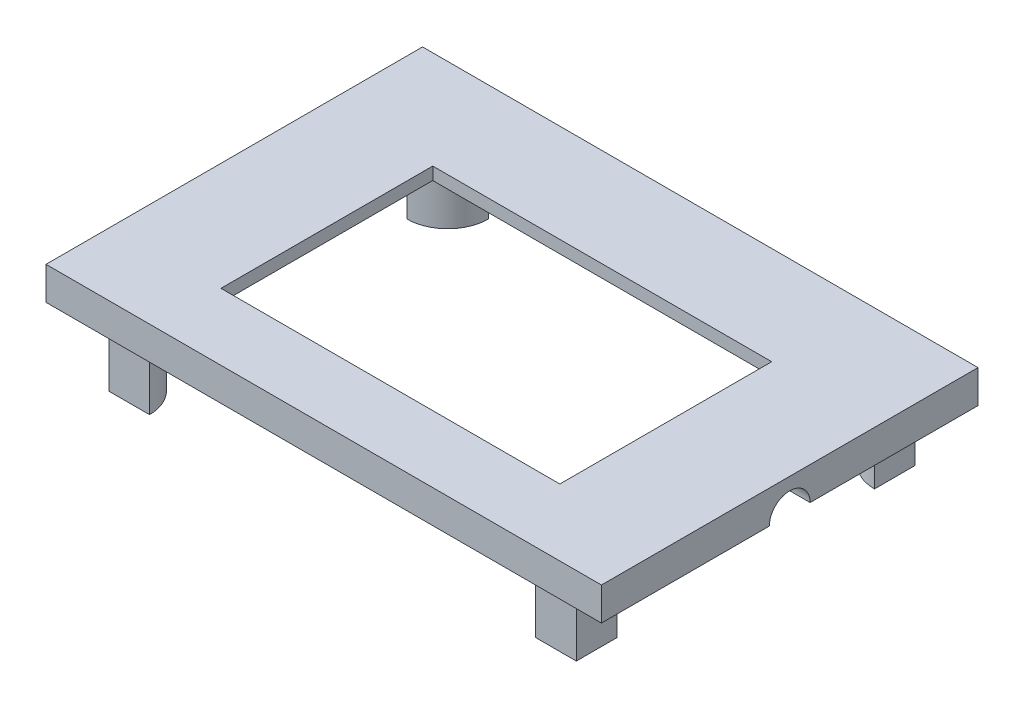
ISO-10303-21;
HEADER;
FILE_DESCRIPTION(('STEP AP214'),'2;1');
FILE_NAME('part.step','',(''),(''),'','','');
FILE_SCHEMA(('AUTOMOTIVE_DESIGN { 1 0 10303 214 1 1 1 1 }'));
ENDSEC;
DATA;
#1=APPLICATION_CONTEXT('core data for automotive mechanical design processes');
#2=APPLICATION_PROTOCOL_DEFINITION('international standard','automotive_design',2000,#1);
#3=PRODUCT_CONTEXT('',#1,'mechanical');
#4=PRODUCT('Part','Part','',(#3));
#5=PRODUCT_RELATED_PRODUCT_CATEGORY('part','',(#4));
#6=PRODUCT_DEFINITION_FORMATION('','',#4);
#7=PRODUCT_DEFINITION_CONTEXT('part definition',#1,'design');
#8=PRODUCT_DEFINITION('design','',#6,#7);
#9=PRODUCT_DEFINITION_SHAPE('','',#8);
#10=(LENGTH_UNIT() NAMED_UNIT(*) SI_UNIT(.MILLI.,.METRE.));
#11=(NAMED_UNIT(*) PLANE_ANGLE_UNIT() SI_UNIT($,.RADIAN.));
#12=(NAMED_UNIT(*) SI_UNIT($,.STERADIAN.) SOLID_ANGLE_UNIT());
#13=UNCERTAINTY_MEASURE_WITH_UNIT(LENGTH_MEASURE(1.E-05),#10,'distance_accuracy_value','');
#14=(GEOMETRIC_REPRESENTATION_CONTEXT(3) GLOBAL_UNCERTAINTY_ASSIGNED_CONTEXT((#13)) GLOBAL_UNIT_ASSIGNED_CONTEXT((#10,
#11,#12)) REPRESENTATION_CONTEXT('',''));
#15=CARTESIAN_POINT('',(0.,0.,0.));
#16=DIRECTION('',(0.,0.,1.));
#17=DIRECTION('',(1.,0.,0.));
#18=AXIS2_PLACEMENT_3D('',#15,#16,#17);
#19=CARTESIAN_POINT('',(-29.8,-2.6,0.));
#20=DIRECTION('',(1.,0.,0.));
#21=DIRECTION('',(0.,0.,-1.));
#22=AXIS2_PLACEMENT_3D('',#19,#20,#21);
#23=PLANE('',#22);
#24=CARTESIAN_POINT('',(-29.8,-2.6,0.));
#25=DIRECTION('',(1.,0.,0.));
#26=DIRECTION('',(0.,0.,-1.));
#27=AXIS2_PLACEMENT_3D('',#24,#25,#26);
#28=CIRCLE('',#27,2.6);
#29=CARTESIAN_POINT('',(-29.8,-2.6,-2.6));
#30=VERTEX_POINT('',#29);
#31=CARTESIAN_POINT('',(-29.8,0.,0.));
#32=VERTEX_POINT('',#31);
#33=EDGE_CURVE('E629',#30,#32,#28,.T.);
#34=ORIENTED_EDGE('',*,*,#33,.F.);
#35=DIRECTION('',(0.,0.,-1.));
#36=VECTOR('',#35,1.);
#37=CARTESIAN_POINT('',(-29.8,-2.6,0.));
#38=LINE('',#37,#36);
#39=CARTESIAN_POINT('',(-29.8,-2.6,-16.4));
#40=VERTEX_POINT('',#39);
#41=EDGE_CURVE('E487',#30,#40,#38,.T.);
#42=ORIENTED_EDGE('',*,*,#41,.T.);
#43=DIRECTION('',(0.,1.,0.));
#44=VECTOR('',#43,1.);
#45=CARTESIAN_POINT('',(-29.8,-10.8,-16.4));
#46=LINE('',#45,#44);
#47=CARTESIAN_POINT('',(-29.8,0.,-16.4));
#48=VERTEX_POINT('',#47);
#49=EDGE_CURVE('E331',#40,#48,#46,.T.);
#50=ORIENTED_EDGE('',*,*,#49,.T.);
#51=DIRECTION('',(0.,0.,-1.));
#52=VECTOR('',#51,1.);
#53=CARTESIAN_POINT('',(-29.8,0.,0.));
#54=LINE('',#53,#52);
#55=EDGE_CURVE('E261',#32,#48,#54,.T.);
#56=ORIENTED_EDGE('',*,*,#55,.F.);
#57=EDGE_LOOP('',(#34,#42,#50,#56));
#58=FACE_BOUND('',#57,.T.);
#59=ADVANCED_FACE('F33',(#58),#23,.T.);
#60=CARTESIAN_POINT('',(29.8,-2.6,0.));
#61=DIRECTION('',(1.,0.,0.));
#62=DIRECTION('',(0.,0.,-1.));
#63=AXIS2_PLACEMENT_3D('',#60,#61,#62);
#64=PLANE('',#63);
#65=DIRECTION('',(0.,0.,-1.));
#66=VECTOR('',#65,1.);
#67=CARTESIAN_POINT('',(29.8,-2.6,0.));
#68=LINE('',#67,#66);
#69=CARTESIAN_POINT('',(29.8,-2.6,-2.6));
#70=VERTEX_POINT('',#69);
#71=CARTESIAN_POINT('',(29.8,-2.6,-16.4));
#72=VERTEX_POINT('',#71);
#73=EDGE_CURVE('E439',#70,#72,#68,.T.);
#74=ORIENTED_EDGE('',*,*,#73,.F.);
#75=CARTESIAN_POINT('',(29.8,-2.6,0.));
#76=DIRECTION('',(1.,0.,0.));
#77=DIRECTION('',(0.,0.,-1.));
#78=AXIS2_PLACEMENT_3D('',#75,#76,#77);
#79=CIRCLE('',#78,2.6);
#80=CARTESIAN_POINT('',(29.8,0.,0.));
#81=VERTEX_POINT('',#80);
#82=EDGE_CURVE('E56',#70,#81,#79,.T.);
#83=ORIENTED_EDGE('',*,*,#82,.T.);
#84=DIRECTION('',(0.,0.,-1.));
#85=VECTOR('',#84,1.);
#86=CARTESIAN_POINT('',(29.8,0.,0.));
#87=LINE('',#86,#85);
#88=CARTESIAN_POINT('',(29.8,0.,-16.4));
#89=VERTEX_POINT('',#88);
#90=EDGE_CURVE('E259',#81,#89,#87,.T.);
#91=ORIENTED_EDGE('',*,*,#90,.T.);
#92=DIRECTION('',(0.,1.,0.));
#93=VECTOR('',#92,1.);
#94=CARTESIAN_POINT('',(29.8,-10.8,-16.4));
#95=LINE('',#94,#93);
#96=EDGE_CURVE('E270',#72,#89,#95,.T.);
#97=ORIENTED_EDGE('',*,*,#96,.F.);
#98=EDGE_LOOP('',(#74,#83,#91,#97));
#99=FACE_BOUND('',#98,.T.);
#100=ADVANCED_FACE('F528',(#99),#64,.F.);
#101=CARTESIAN_POINT('',(0.,-2.6,0.));
#102=DIRECTION('',(0.,1.,0.));
#103=DIRECTION('',(0.,0.,1.));
#104=AXIS2_PLACEMENT_3D('',#101,#102,#103);
#105=PLANE('',#104);
#106=DIRECTION('',(0.,0.,-1.));
#107=VECTOR('',#106,1.);
#108=CARTESIAN_POINT('',(-35.4,-2.6,0.));
#109=LINE('',#108,#107);
#110=CARTESIAN_POINT('',(-35.4,-2.6,24.));
#111=VERTEX_POINT('',#110);
#112=CARTESIAN_POINT('',(-35.4,-2.6,2.6));
#113=VERTEX_POINT('',#112);
#114=EDGE_CURVE('E251',#111,#113,#109,.T.);
#115=ORIENTED_EDGE('',*,*,#114,.T.);
#116=DIRECTION('',(1.,0.,0.));
#117=VECTOR('',#116,1.);
#118=CARTESIAN_POINT('',(-41.2137767414995,-2.6,2.6));
#119=LINE('',#118,#117);
#120=CARTESIAN_POINT('',(-29.8,-2.6,2.6));
#121=VERTEX_POINT('',#120);
#122=EDGE_CURVE('E501',#113,#121,#119,.T.);
#123=ORIENTED_EDGE('',*,*,#122,.T.);
#124=CARTESIAN_POINT('',(-29.8,-2.6,16.4));
#125=VERTEX_POINT('',#124);
#126=EDGE_CURVE('E486',#125,#121,#38,.T.);
#127=ORIENTED_EDGE('',*,*,#126,.F.);
#128=CARTESIAN_POINT('',(-29.8,-2.6,21.6));
#129=VERTEX_POINT('',#128);
#130=EDGE_CURVE('E455',#129,#125,#38,.T.);
#131=ORIENTED_EDGE('',*,*,#130,.F.);
#132=DIRECTION('',(1.,0.,0.));
#133=VECTOR('',#132,1.);
#134=CARTESIAN_POINT('',(0.,-2.6,21.6));
#135=LINE('',#134,#133);
#136=CARTESIAN_POINT('',(-24.6,-2.6,21.6));
#137=VERTEX_POINT('',#136);
#138=EDGE_CURVE('E440',#129,#137,#135,.T.);
#139=ORIENTED_EDGE('',*,*,#138,.T.);
#140=CARTESIAN_POINT('',(24.6,-2.6,21.6));
#141=VERTEX_POINT('',#140);
#142=EDGE_CURVE('E436',#137,#141,#135,.T.);
#143=ORIENTED_EDGE('',*,*,#142,.T.);
#144=DIRECTION('',(-1.,0.,0.));
#145=VECTOR('',#144,1.);
#146=CARTESIAN_POINT('',(0.,-2.6,21.6));
#147=LINE('',#146,#145);
#148=CARTESIAN_POINT('',(29.8,-2.6,21.6));
#149=VERTEX_POINT('',#148);
#150=EDGE_CURVE('E227',#149,#141,#147,.T.);
#151=ORIENTED_EDGE('',*,*,#150,.F.);
#152=CARTESIAN_POINT('',(29.8,-2.6,16.4));
#153=VERTEX_POINT('',#152);
#154=EDGE_CURVE('E434',#149,#153,#68,.T.);
#155=ORIENTED_EDGE('',*,*,#154,.T.);
#156=CARTESIAN_POINT('',(29.8,-2.6,2.6));
#157=VERTEX_POINT('',#156);
#158=EDGE_CURVE('E437',#153,#157,#68,.T.);
#159=ORIENTED_EDGE('',*,*,#158,.T.);
#160=DIRECTION('',(1.,0.,0.));
#161=VECTOR('',#160,1.);
#162=CARTESIAN_POINT('',(-41.2137767414995,-2.6,2.6));
#163=LINE('',#162,#161);
#164=CARTESIAN_POINT('',(35.4,-2.6,2.6));
#165=VERTEX_POINT('',#164);
#166=EDGE_CURVE('E11',#157,#165,#163,.T.);
#167=ORIENTED_EDGE('',*,*,#166,.T.);
#168=DIRECTION('',(0.,0.,-1.));
#169=VECTOR('',#168,1.);
#170=CARTESIAN_POINT('',(35.4,-2.6,0.));
#171=LINE('',#170,#169);
#172=CARTESIAN_POINT('',(35.4,-2.6,24.));
#173=VERTEX_POINT('',#172);
#174=EDGE_CURVE('E235',#173,#165,#171,.T.);
#175=ORIENTED_EDGE('',*,*,#174,.F.);
#176=DIRECTION('',(1.,0.,0.));
#177=VECTOR('',#176,1.);
#178=CARTESIAN_POINT('',(0.,-2.6,24.));
#179=LINE('',#178,#177);
#180=EDGE_CURVE('E242',#111,#173,#179,.T.);
#181=ORIENTED_EDGE('',*,*,#180,.F.);
#182=EDGE_LOOP('',(#115,#123,#127,#131,#139,#143,#151,#155,#159,#167,#175,#181));
#183=FACE_BOUND('',#182,.T.);
#184=ADVANCED_FACE('F500',(#183),#105,.F.);
#185=CARTESIAN_POINT('',(0.,0.,0.));
#186=DIRECTION('',(0.,1.,0.));
#187=DIRECTION('',(0.,0.,1.));
#188=AXIS2_PLACEMENT_3D('',#185,#186,#187);
#189=PLANE('',#188);
#190=DIRECTION('',(0.,0.,1.));
#191=VECTOR('',#190,1.);
#192=CARTESIAN_POINT('',(-21.6,0.,0.));
#193=LINE('',#192,#191);
#194=CARTESIAN_POINT('',(-21.6,0.,-11.5));
#195=VERTEX_POINT('',#194);
#196=CARTESIAN_POINT('',(-21.6,0.,15.5));
#197=VERTEX_POINT('',#196);
#198=EDGE_CURVE('E367',#195,#197,#193,.T.);
#199=ORIENTED_EDGE('',*,*,#198,.T.);
#200=DIRECTION('',(1.,0.,0.));
#201=VECTOR('',#200,1.);
#202=CARTESIAN_POINT('',(0.,0.,15.5));
#203=LINE('',#202,#201);
#204=CARTESIAN_POINT('',(21.6,0.,15.5));
#205=VERTEX_POINT('',#204);
#206=EDGE_CURVE('E391',#197,#205,#203,.T.);
#207=ORIENTED_EDGE('',*,*,#206,.T.);
#208=DIRECTION('',(0.,0.,1.));
#209=VECTOR('',#208,1.);
#210=CARTESIAN_POINT('',(21.6,0.,0.));
#211=LINE('',#210,#209);
#212=CARTESIAN_POINT('',(21.6,0.,-11.5));
#213=VERTEX_POINT('',#212);
#214=EDGE_CURVE('E389',#213,#205,#211,.T.);
#215=ORIENTED_EDGE('',*,*,#214,.F.);
#216=DIRECTION('',(1.,0.,0.));
#217=VECTOR('',#216,1.);
#218=CARTESIAN_POINT('',(0.,0.,-11.5));
#219=LINE('',#218,#217);
#220=EDGE_CURVE('E357',#195,#213,#219,.T.);
#221=ORIENTED_EDGE('',*,*,#220,.F.);
#222=EDGE_LOOP('',(#199,#207,#215,#221));
#223=FACE_BOUND('',#222,.T.);
#224=CARTESIAN_POINT('',(-29.8,0.,16.4));
#225=VERTEX_POINT('',#224);
#226=EDGE_CURVE('E262',#225,#32,#54,.T.);
#227=ORIENTED_EDGE('',*,*,#226,.T.);
#228=ORIENTED_EDGE('',*,*,#55,.T.);
#229=CARTESIAN_POINT('',(-29.8,0.,-21.6));
#230=DIRECTION('',(0.,1.,0.));
#231=DIRECTION('',(0.,0.,1.));
#232=AXIS2_PLACEMENT_3D('',#229,#230,#231);
#233=CIRCLE('',#232,5.2);
#234=CARTESIAN_POINT('',(-24.6,0.,-21.6));
#235=VERTEX_POINT('',#234);
#236=EDGE_CURVE('E316',#48,#235,#233,.T.);
#237=ORIENTED_EDGE('',*,*,#236,.T.);
#238=DIRECTION('',(1.,0.,0.));
#239=VECTOR('',#238,1.);
#240=CARTESIAN_POINT('',(0.,0.,-21.6));
#241=LINE('',#240,#239);
#242=CARTESIAN_POINT('',(24.6,0.,-21.6));
#243=VERTEX_POINT('',#242);
#244=EDGE_CURVE('E265',#235,#243,#241,.T.);
#245=ORIENTED_EDGE('',*,*,#244,.T.);
#246=CARTESIAN_POINT('',(29.8,0.,-21.6));
#247=DIRECTION('',(0.,1.,0.));
#248=DIRECTION('',(0.,0.,1.));
#249=AXIS2_PLACEMENT_3D('',#246,#247,#248);
#250=CIRCLE('',#249,5.2);
#251=EDGE_CURVE('E295',#243,#89,#250,.T.);
#252=ORIENTED_EDGE('',*,*,#251,.T.);
#253=ORIENTED_EDGE('',*,*,#90,.F.);
#254=CARTESIAN_POINT('',(29.8,0.,16.4));
#255=VERTEX_POINT('',#254);
#256=EDGE_CURVE('E255',#255,#81,#87,.T.);
#257=ORIENTED_EDGE('',*,*,#256,.F.);
#258=CARTESIAN_POINT('',(29.8,0.,21.6));
#259=DIRECTION('',(0.,1.,0.));
#260=DIRECTION('',(0.,0.,1.));
#261=AXIS2_PLACEMENT_3D('',#258,#259,#260);
#262=CIRCLE('',#261,5.2);
#263=CARTESIAN_POINT('',(24.6,0.,21.6));
#264=VERTEX_POINT('',#263);
#265=EDGE_CURVE('E280',#264,#255,#262,.F.);
#266=ORIENTED_EDGE('',*,*,#265,.F.);
#267=DIRECTION('',(1.,0.,0.));
#268=VECTOR('',#267,1.);
#269=CARTESIAN_POINT('',(0.,0.,21.6));
#270=LINE('',#269,#268);
#271=CARTESIAN_POINT('',(-24.6,0.,21.6));
#272=VERTEX_POINT('',#271);
#273=EDGE_CURVE('E258',#272,#264,#270,.T.);
#274=ORIENTED_EDGE('',*,*,#273,.F.);
#275=CARTESIAN_POINT('',(-29.8,0.,21.6));
#276=DIRECTION('',(0.,1.,0.));
#277=DIRECTION('',(0.,0.,1.));
#278=AXIS2_PLACEMENT_3D('',#275,#276,#277);
#279=CIRCLE('',#278,5.2);
#280=EDGE_CURVE('E337',#225,#272,#279,.F.);
#281=ORIENTED_EDGE('',*,*,#280,.F.);
#282=EDGE_LOOP('',(#227,#228,#237,#245,#252,#253,#257,#266,#274,#281));
#283=FACE_BOUND('',#282,.T.);
#284=ADVANCED_FACE('F469',(#223,#283),#189,.F.);
#285=CARTESIAN_POINT('',(0.,-10.8,21.6));
#286=DIRECTION('',(0.,0.,1.));
#287=DIRECTION('',(1.,0.,0.));
#288=AXIS2_PLACEMENT_3D('',#285,#286,#287);
#289=PLANE('',#288);
#290=DIRECTION('',(0.,1.,0.));
#291=VECTOR('',#290,1.);
#292=CARTESIAN_POINT('',(-24.6,-10.8,21.6));
#293=LINE('',#292,#291);
#294=CARTESIAN_POINT('',(-24.6,-10.8,21.6));
#295=VERTEX_POINT('',#294);
#296=EDGE_CURVE('E354',#295,#137,#293,.T.);
#297=ORIENTED_EDGE('',*,*,#296,.T.);
#298=ORIENTED_EDGE('',*,*,#138,.F.);
#299=DIRECTION('',(0.,1.,0.));
#300=VECTOR('',#299,1.);
#301=CARTESIAN_POINT('',(-29.8,-10.8,21.6));
#302=LINE('',#301,#300);
#303=CARTESIAN_POINT('',(-29.8,-10.8,21.6));
#304=VERTEX_POINT('',#303);
#305=EDGE_CURVE('E358',#304,#129,#302,.T.);
#306=ORIENTED_EDGE('',*,*,#305,.F.);
#307=DIRECTION('',(1.,0.,0.));
#308=VECTOR('',#307,1.);
#309=CARTESIAN_POINT('',(0.,-10.8,21.6));
#310=LINE('',#309,#308);
#311=EDGE_CURVE('E348',#304,#295,#310,.T.);
#312=ORIENTED_EDGE('',*,*,#311,.T.);
#313=EDGE_LOOP('',(#297,#298,#306,#312));
#314=FACE_BOUND('',#313,.T.);
#315=ADVANCED_FACE('F515',(#314),#289,.T.);
#316=CARTESIAN_POINT('',(-29.8,-10.8,0.));
#317=DIRECTION('',(1.,0.,0.));
#318=DIRECTION('',(0.,0.,-1.));
#319=AXIS2_PLACEMENT_3D('',#316,#317,#318);
#320=PLANE('',#319);
#321=ORIENTED_EDGE('',*,*,#130,.T.);
#322=DIRECTION('',(0.,1.,0.));
#323=VECTOR('',#322,1.);
#324=CARTESIAN_POINT('',(-29.8,-10.8,16.4));
#325=LINE('',#324,#323);
#326=CARTESIAN_POINT('',(-29.8,-10.8,16.4));
#327=VERTEX_POINT('',#326);
#328=EDGE_CURVE('E351',#327,#125,#325,.T.);
#329=ORIENTED_EDGE('',*,*,#328,.F.);
#330=DIRECTION('',(0.,0.,-1.));
#331=VECTOR('',#330,1.);
#332=CARTESIAN_POINT('',(-29.8,-10.8,0.));
#333=LINE('',#332,#331);
#334=EDGE_CURVE('E346',#304,#327,#333,.T.);
#335=ORIENTED_EDGE('',*,*,#334,.F.);
#336=ORIENTED_EDGE('',*,*,#305,.T.);
#337=EDGE_LOOP('',(#321,#329,#335,#336));
#338=FACE_BOUND('',#337,.T.);
#339=ADVANCED_FACE('F504',(#338),#320,.F.);
#340=CARTESIAN_POINT('',(-29.8,-10.8,0.));
#341=DIRECTION('',(1.,0.,0.));
#342=DIRECTION('',(0.,0.,-1.));
#343=AXIS2_PLACEMENT_3D('',#340,#341,#342);
#344=PLANE('',#343);
#345=CARTESIAN_POINT('',(-29.8,-2.6,-21.6));
#346=VERTEX_POINT('',#345);
#347=EDGE_CURVE('E489',#40,#346,#38,.T.);
#348=ORIENTED_EDGE('',*,*,#347,.T.);
#349=DIRECTION('',(0.,1.,0.));
#350=VECTOR('',#349,1.);
#351=CARTESIAN_POINT('',(-29.8,-10.8,-21.6));
#352=LINE('',#351,#350);
#353=CARTESIAN_POINT('',(-29.8,-10.8,-21.6));
#354=VERTEX_POINT('',#353);
#355=EDGE_CURVE('E334',#354,#346,#352,.T.);
#356=ORIENTED_EDGE('',*,*,#355,.F.);
#357=DIRECTION('',(0.,0.,-1.));
#358=VECTOR('',#357,1.);
#359=CARTESIAN_POINT('',(-29.8,-10.8,0.));
#360=LINE('',#359,#358);
#361=CARTESIAN_POINT('',(-29.8,-10.8,-16.4));
#362=VERTEX_POINT('',#361);
#363=EDGE_CURVE('E323',#362,#354,#360,.T.);
#364=ORIENTED_EDGE('',*,*,#363,.F.);
#365=EDGE_CURVE('E341',#362,#40,#46,.T.);
#366=ORIENTED_EDGE('',*,*,#365,.T.);
#367=EDGE_LOOP('',(#348,#356,#364,#366));
#368=FACE_BOUND('',#367,.T.);
#369=ADVANCED_FACE('F522',(#368),#344,.F.);
#370=CARTESIAN_POINT('',(0.,-10.8,-21.6));
#371=DIRECTION('',(0.,0.,1.));
#372=DIRECTION('',(1.,0.,0.));
#373=AXIS2_PLACEMENT_3D('',#370,#371,#372);
#374=PLANE('',#373);
#375=DIRECTION('',(1.,0.,0.));
#376=VECTOR('',#375,1.);
#377=CARTESIAN_POINT('',(0.,-2.6,-21.6));
#378=LINE('',#377,#376);
#379=CARTESIAN_POINT('',(-24.6,-2.6,-21.6));
#380=VERTEX_POINT('',#379);
#381=EDGE_CURVE('E245',#346,#380,#378,.T.);
#382=ORIENTED_EDGE('',*,*,#381,.T.);
#383=DIRECTION('',(0.,1.,0.));
#384=VECTOR('',#383,1.);
#385=CARTESIAN_POINT('',(-24.6,-10.8,-21.6));
#386=LINE('',#385,#384);
#387=CARTESIAN_POINT('',(-24.6,-10.8,-21.6));
#388=VERTEX_POINT('',#387);
#389=EDGE_CURVE('E338',#388,#380,#386,.T.);
#390=ORIENTED_EDGE('',*,*,#389,.F.);
#391=DIRECTION('',(1.,0.,0.));
#392=VECTOR('',#391,1.);
#393=CARTESIAN_POINT('',(0.,-10.8,-21.6));
#394=LINE('',#393,#392);
#395=EDGE_CURVE('E329',#354,#388,#394,.T.);
#396=ORIENTED_EDGE('',*,*,#395,.F.);
#397=ORIENTED_EDGE('',*,*,#355,.T.);
#398=EDGE_LOOP('',(#382,#390,#396,#397));
#399=FACE_BOUND('',#398,.T.);
#400=ADVANCED_FACE('F482',(#399),#374,.F.);
#401=CARTESIAN_POINT('',(0.,-10.8,-21.6));
#402=DIRECTION('',(0.,0.,1.));
#403=DIRECTION('',(1.,0.,0.));
#404=AXIS2_PLACEMENT_3D('',#401,#402,#403);
#405=PLANE('',#404);
#406=CARTESIAN_POINT('',(24.6,-2.6,-21.6));
#407=VERTEX_POINT('',#406);
#408=CARTESIAN_POINT('',(29.8,-2.6,-21.6));
#409=VERTEX_POINT('',#408);
#410=EDGE_CURVE('E447',#407,#409,#378,.T.);
#411=ORIENTED_EDGE('',*,*,#410,.T.);
#412=DIRECTION('',(0.,1.,0.));
#413=VECTOR('',#412,1.);
#414=CARTESIAN_POINT('',(29.8,-10.8,-21.6));
#415=LINE('',#414,#413);
#416=CARTESIAN_POINT('',(29.8,-10.8,-21.6));
#417=VERTEX_POINT('',#416);
#418=EDGE_CURVE('E313',#417,#409,#415,.T.);
#419=ORIENTED_EDGE('',*,*,#418,.F.);
#420=DIRECTION('',(1.,0.,0.));
#421=VECTOR('',#420,1.);
#422=CARTESIAN_POINT('',(0.,-10.8,-21.6));
#423=LINE('',#422,#421);
#424=CARTESIAN_POINT('',(24.6,-10.8,-21.6));
#425=VERTEX_POINT('',#424);
#426=EDGE_CURVE('E302',#425,#417,#423,.T.);
#427=ORIENTED_EDGE('',*,*,#426,.F.);
#428=DIRECTION('',(0.,1.,0.));
#429=VECTOR('',#428,1.);
#430=CARTESIAN_POINT('',(24.6,-10.8,-21.6));
#431=LINE('',#430,#429);
#432=EDGE_CURVE('E320',#425,#407,#431,.T.);
#433=ORIENTED_EDGE('',*,*,#432,.T.);
#434=EDGE_LOOP('',(#411,#419,#427,#433));
#435=FACE_BOUND('',#434,.T.);
#436=ADVANCED_FACE('F452',(#435),#405,.F.);
#437=CARTESIAN_POINT('',(29.8,-10.8,0.));
#438=DIRECTION('',(1.,0.,0.));
#439=DIRECTION('',(0.,0.,-1.));
#440=AXIS2_PLACEMENT_3D('',#437,#438,#439);
#441=PLANE('',#440);
#442=ORIENTED_EDGE('',*,*,#418,.T.);
#443=EDGE_CURVE('E268',#72,#409,#68,.T.);
#444=ORIENTED_EDGE('',*,*,#443,.F.);
#445=DIRECTION('',(0.,1.,0.));
#446=VECTOR('',#445,1.);
#447=CARTESIAN_POINT('',(29.8,-10.8,-16.4));
#448=LINE('',#447,#446);
#449=CARTESIAN_POINT('',(29.8,-10.8,-16.4));
#450=VERTEX_POINT('',#449);
#451=EDGE_CURVE('E317',#450,#72,#448,.T.);
#452=ORIENTED_EDGE('',*,*,#451,.F.);
#453=DIRECTION('',(0.,0.,-1.));
#454=VECTOR('',#453,1.);
#455=CARTESIAN_POINT('',(29.8,-10.8,0.));
#456=LINE('',#455,#454);
#457=EDGE_CURVE('E307',#450,#417,#456,.T.);
#458=ORIENTED_EDGE('',*,*,#457,.T.);
#459=EDGE_LOOP('',(#442,#444,#452,#458));
#460=FACE_BOUND('',#459,.T.);
#461=ADVANCED_FACE('F456',(#460),#441,.T.);
#462=CARTESIAN_POINT('',(29.8,-10.8,0.));
#463=DIRECTION('',(1.,0.,0.));
#464=DIRECTION('',(0.,0.,-1.));
#465=AXIS2_PLACEMENT_3D('',#462,#463,#464);
#466=PLANE('',#465);
#467=DIRECTION('',(0.,1.,0.));
#468=VECTOR('',#467,1.);
#469=CARTESIAN_POINT('',(29.8,-10.8,16.4));
#470=LINE('',#469,#468);
#471=CARTESIAN_POINT('',(29.8,-10.8,16.4));
#472=VERTEX_POINT('',#471);
#473=EDGE_CURVE('E292',#472,#153,#470,.T.);
#474=ORIENTED_EDGE('',*,*,#473,.T.);
#475=ORIENTED_EDGE('',*,*,#154,.F.);
#476=DIRECTION('',(0.,1.,0.));
#477=VECTOR('',#476,1.);
#478=CARTESIAN_POINT('',(29.8,-10.8,21.6));
#479=LINE('',#478,#477);
#480=CARTESIAN_POINT('',(29.8,-10.8,21.6));
#481=VERTEX_POINT('',#480);
#482=EDGE_CURVE('E296',#481,#149,#479,.T.);
#483=ORIENTED_EDGE('',*,*,#482,.F.);
#484=DIRECTION('',(0.,0.,-1.));
#485=VECTOR('',#484,1.);
#486=CARTESIAN_POINT('',(29.8,-10.8,0.));
#487=LINE('',#486,#485);
#488=EDGE_CURVE('E286',#481,#472,#487,.T.);
#489=ORIENTED_EDGE('',*,*,#488,.T.);
#490=EDGE_LOOP('',(#474,#475,#483,#489));
#491=FACE_BOUND('',#490,.T.);
#492=ADVANCED_FACE('F433',(#491),#466,.T.);
#493=CARTESIAN_POINT('',(0.,-10.8,21.6));
#494=DIRECTION('',(0.,0.,1.));
#495=DIRECTION('',(1.,0.,0.));
#496=AXIS2_PLACEMENT_3D('',#493,#494,#495);
#497=PLANE('',#496);
#498=ORIENTED_EDGE('',*,*,#482,.T.);
#499=ORIENTED_EDGE('',*,*,#150,.T.);
#500=DIRECTION('',(0.,1.,0.));
#501=VECTOR('',#500,1.);
#502=CARTESIAN_POINT('',(24.6,-10.8,21.6));
#503=LINE('',#502,#501);
#504=CARTESIAN_POINT('',(24.6,-10.8,21.6));
#505=VERTEX_POINT('',#504);
#506=EDGE_CURVE('E299',#505,#141,#503,.T.);
#507=ORIENTED_EDGE('',*,*,#506,.F.);
#508=DIRECTION('',(1.,0.,0.));
#509=VECTOR('',#508,1.);
#510=CARTESIAN_POINT('',(0.,-10.8,21.6));
#511=LINE('',#510,#509);
#512=EDGE_CURVE('E283',#505,#481,#511,.T.);
#513=ORIENTED_EDGE('',*,*,#512,.T.);
#514=EDGE_LOOP('',(#498,#499,#507,#513));
#515=FACE_BOUND('',#514,.T.);
#516=ADVANCED_FACE('F416',(#515),#497,.T.);
#517=CARTESIAN_POINT('',(0.,1.6,-11.5));
#518=DIRECTION('',(0.,0.,-1.));
#519=DIRECTION('',(-1.,0.,0.));
#520=AXIS2_PLACEMENT_3D('',#517,#518,#519);
#521=PLANE('',#520);
#522=ORIENTED_EDGE('',*,*,#220,.T.);
#523=DIRECTION('',(0.,-1.,0.));
#524=VECTOR('',#523,1.);
#525=CARTESIAN_POINT('',(21.6,1.6,-11.5));
#526=LINE('',#525,#524);
#527=CARTESIAN_POINT('',(21.6,1.6,-11.5));
#528=VERTEX_POINT('',#527);
#529=EDGE_CURVE('E404',#528,#213,#526,.T.);
#530=ORIENTED_EDGE('',*,*,#529,.F.);
#531=DIRECTION('',(1.,0.,0.));
#532=VECTOR('',#531,1.);
#533=CARTESIAN_POINT('',(0.,1.6,-11.5));
#534=LINE('',#533,#532);
#535=CARTESIAN_POINT('',(-21.6,1.6,-11.5));
#536=VERTEX_POINT('',#535);
#537=EDGE_CURVE('E375',#536,#528,#534,.T.);
#538=ORIENTED_EDGE('',*,*,#537,.F.);
#539=DIRECTION('',(0.,-1.,0.));
#540=VECTOR('',#539,1.);
#541=CARTESIAN_POINT('',(-21.6,1.6,-11.5));
#542=LINE('',#541,#540);
#543=EDGE_CURVE('E395',#536,#195,#542,.T.);
#544=ORIENTED_EDGE('',*,*,#543,.T.);
#545=EDGE_LOOP('',(#522,#530,#538,#544));
#546=FACE_BOUND('',#545,.T.);
#547=ADVANCED_FACE('F556',(#546),#521,.F.);
#548=CARTESIAN_POINT('',(21.6,1.6,0.));
#549=DIRECTION('',(1.,0.,0.));
#550=DIRECTION('',(0.,0.,-1.));
#551=AXIS2_PLACEMENT_3D('',#548,#549,#550);
#552=PLANE('',#551);
#553=ORIENTED_EDGE('',*,*,#214,.T.);
#554=DIRECTION('',(0.,-1.,0.));
#555=VECTOR('',#554,1.);
#556=CARTESIAN_POINT('',(21.6,1.6,15.5));
#557=LINE('',#556,#555);
#558=CARTESIAN_POINT('',(21.6,1.6,15.5));
#559=VERTEX_POINT('',#558);
#560=EDGE_CURVE('E401',#559,#205,#557,.T.);
#561=ORIENTED_EDGE('',*,*,#560,.F.);
#562=DIRECTION('',(0.,0.,1.));
#563=VECTOR('',#562,1.);
#564=CARTESIAN_POINT('',(21.6,1.6,0.));
#565=LINE('',#564,#563);
#566=EDGE_CURVE('E378',#528,#559,#565,.T.);
#567=ORIENTED_EDGE('',*,*,#566,.F.);
#568=ORIENTED_EDGE('',*,*,#529,.T.);
#569=EDGE_LOOP('',(#553,#561,#567,#568));
#570=FACE_BOUND('',#569,.T.);
#571=ADVANCED_FACE('F595',(#570),#552,.F.);
#572=CARTESIAN_POINT('',(0.,1.6,15.5));
#573=DIRECTION('',(0.,0.,-1.));
#574=DIRECTION('',(-1.,0.,0.));
#575=AXIS2_PLACEMENT_3D('',#572,#573,#574);
#576=PLANE('',#575);
#577=ORIENTED_EDGE('',*,*,#206,.F.);
#578=DIRECTION('',(0.,-1.,0.));
#579=VECTOR('',#578,1.);
#580=CARTESIAN_POINT('',(-21.6,1.6,15.5));
#581=LINE('',#580,#579);
#582=CARTESIAN_POINT('',(-21.6,1.6,15.5));
#583=VERTEX_POINT('',#582);
#584=EDGE_CURVE('E397',#583,#197,#581,.T.);
#585=ORIENTED_EDGE('',*,*,#584,.F.);
#586=DIRECTION('',(1.,0.,0.));
#587=VECTOR('',#586,1.);
#588=CARTESIAN_POINT('',(0.,1.6,15.5));
#589=LINE('',#588,#587);
#590=EDGE_CURVE('E380',#583,#559,#589,.T.);
#591=ORIENTED_EDGE('',*,*,#590,.T.);
#592=ORIENTED_EDGE('',*,*,#560,.T.);
#593=EDGE_LOOP('',(#577,#585,#591,#592));
#594=FACE_BOUND('',#593,.T.);
#595=ADVANCED_FACE('F592',(#594),#576,.T.);
#596=CARTESIAN_POINT('',(0.,1.6,24.));
#597=DIRECTION('',(0.,0.,-1.));
#598=DIRECTION('',(-1.,0.,0.));
#599=AXIS2_PLACEMENT_3D('',#596,#597,#598);
#600=PLANE('',#599);
#601=DIRECTION('',(0.,-1.,0.));
#602=VECTOR('',#601,1.);
#603=CARTESIAN_POINT('',(-35.4,1.6,24.));
#604=LINE('',#603,#602);
#605=CARTESIAN_POINT('',(-35.4,1.6,24.));
#606=VERTEX_POINT('',#605);
#607=EDGE_CURVE('E386',#606,#111,#604,.T.);
#608=ORIENTED_EDGE('',*,*,#607,.T.);
#609=ORIENTED_EDGE('',*,*,#180,.T.);
#610=DIRECTION('',(0.,-1.,0.));
#611=VECTOR('',#610,1.);
#612=CARTESIAN_POINT('',(35.4,1.6,24.));
#613=LINE('',#612,#611);
#614=CARTESIAN_POINT('',(35.4,1.6,24.));
#615=VERTEX_POINT('',#614);
#616=EDGE_CURVE('E398',#615,#173,#613,.T.);
#617=ORIENTED_EDGE('',*,*,#616,.F.);
#618=DIRECTION('',(1.,0.,0.));
#619=VECTOR('',#618,1.);
#620=CARTESIAN_POINT('',(0.,1.6,24.));
#621=LINE('',#620,#619);
#622=EDGE_CURVE('E363',#606,#615,#621,.T.);
#623=ORIENTED_EDGE('',*,*,#622,.F.);
#624=EDGE_LOOP('',(#608,#609,#617,#623));
#625=FACE_BOUND('',#624,.T.);
#626=ADVANCED_FACE('F35',(#625),#600,.F.);
#627=CARTESIAN_POINT('',(35.4,1.6,0.));
#628=DIRECTION('',(-1.,0.,0.));
#629=DIRECTION('',(0.,0.,1.));
#630=AXIS2_PLACEMENT_3D('',#627,#628,#629);
#631=PLANE('',#630);
#632=ORIENTED_EDGE('',*,*,#174,.T.);
#633=CARTESIAN_POINT('',(35.4,-2.6,0.));
#634=DIRECTION('',(1.,0.,0.));
#635=DIRECTION('',(0.,0.,1.));
#636=AXIS2_PLACEMENT_3D('',#633,#634,#635);
#637=CIRCLE('',#636,2.6);
#638=CARTESIAN_POINT('',(35.4,-2.6,-2.6));
#639=VERTEX_POINT('',#638);
#640=EDGE_CURVE('E223',#639,#165,#637,.T.);
#641=ORIENTED_EDGE('',*,*,#640,.F.);
#642=CARTESIAN_POINT('',(35.4,-2.6,-24.));
#643=VERTEX_POINT('',#642);
#644=EDGE_CURVE('E232',#639,#643,#171,.T.);
#645=ORIENTED_EDGE('',*,*,#644,.T.);
#646=DIRECTION('',(0.,-1.,0.));
#647=VECTOR('',#646,1.);
#648=CARTESIAN_POINT('',(35.4,1.6,-24.));
#649=LINE('',#648,#647);
#650=CARTESIAN_POINT('',(35.4,1.6,-24.));
#651=VERTEX_POINT('',#650);
#652=EDGE_CURVE('E411',#651,#643,#649,.T.);
#653=ORIENTED_EDGE('',*,*,#652,.F.);
#654=DIRECTION('',(0.,0.,-1.));
#655=VECTOR('',#654,1.);
#656=CARTESIAN_POINT('',(35.4,1.6,0.));
#657=LINE('',#656,#655);
#658=EDGE_CURVE('E366',#615,#651,#657,.T.);
#659=ORIENTED_EDGE('',*,*,#658,.F.);
#660=ORIENTED_EDGE('',*,*,#616,.T.);
#661=EDGE_LOOP('',(#632,#641,#645,#653,#659,#660));
#662=FACE_BOUND('',#661,.T.);
#663=ADVANCED_FACE('F230',(#662),#631,.F.);
#664=CARTESIAN_POINT('',(0.,1.6,-24.));
#665=DIRECTION('',(0.,0.,-1.));
#666=DIRECTION('',(-1.,0.,0.));
#667=AXIS2_PLACEMENT_3D('',#664,#665,#666);
#668=PLANE('',#667);
#669=ORIENTED_EDGE('',*,*,#652,.T.);
#670=DIRECTION('',(1.,0.,0.));
#671=VECTOR('',#670,1.);
#672=CARTESIAN_POINT('',(0.,-2.6,-24.));
#673=LINE('',#672,#671);
#674=CARTESIAN_POINT('',(-35.4,-2.6,-24.));
#675=VERTEX_POINT('',#674);
#676=EDGE_CURVE('E241',#675,#643,#673,.T.);
#677=ORIENTED_EDGE('',*,*,#676,.F.);
#678=DIRECTION('',(0.,-1.,0.));
#679=VECTOR('',#678,1.);
#680=CARTESIAN_POINT('',(-35.4,1.6,-24.));
#681=LINE('',#680,#679);
#682=CARTESIAN_POINT('',(-35.4,1.6,-24.));
#683=VERTEX_POINT('',#682);
#684=EDGE_CURVE('E408',#683,#675,#681,.T.);
#685=ORIENTED_EDGE('',*,*,#684,.F.);
#686=DIRECTION('',(1.,0.,0.));
#687=VECTOR('',#686,1.);
#688=CARTESIAN_POINT('',(0.,1.6,-24.));
#689=LINE('',#688,#687);
#690=EDGE_CURVE('E369',#683,#651,#689,.T.);
#691=ORIENTED_EDGE('',*,*,#690,.T.);
#692=EDGE_LOOP('',(#669,#677,#685,#691));
#693=FACE_BOUND('',#692,.T.);
#694=ADVANCED_FACE('F605',(#693),#668,.T.);
#695=CARTESIAN_POINT('',(-35.4,1.6,0.));
#696=DIRECTION('',(-1.,0.,0.));
#697=DIRECTION('',(0.,0.,1.));
#698=AXIS2_PLACEMENT_3D('',#695,#696,#697);
#699=PLANE('',#698);
#700=CARTESIAN_POINT('',(-35.4,-2.6,0.));
#701=DIRECTION('',(-1.,0.,0.));
#702=DIRECTION('',(0.,0.,1.));
#703=AXIS2_PLACEMENT_3D('',#700,#701,#702);
#704=CIRCLE('',#703,2.6);
#705=CARTESIAN_POINT('',(-35.4,-2.6,-2.6));
#706=VERTEX_POINT('',#705);
#707=EDGE_CURVE('E48',#706,#113,#704,.F.);
#708=ORIENTED_EDGE('',*,*,#707,.T.);
#709=ORIENTED_EDGE('',*,*,#114,.F.);
#710=ORIENTED_EDGE('',*,*,#607,.F.);
#711=DIRECTION('',(0.,0.,-1.));
#712=VECTOR('',#711,1.);
#713=CARTESIAN_POINT('',(-35.4,1.6,0.));
#714=LINE('',#713,#712);
#715=EDGE_CURVE('E372',#606,#683,#714,.T.);
#716=ORIENTED_EDGE('',*,*,#715,.T.);
#717=ORIENTED_EDGE('',*,*,#684,.T.);
#718=EDGE_CURVE('E250',#706,#675,#109,.T.);
#719=ORIENTED_EDGE('',*,*,#718,.F.);
#720=EDGE_LOOP('',(#708,#709,#710,#716,#717,#719));
#721=FACE_BOUND('',#720,.T.);
#722=ADVANCED_FACE('F590',(#721),#699,.T.);
#723=CARTESIAN_POINT('',(-21.6,1.6,0.));
#724=DIRECTION('',(1.,0.,0.));
#725=DIRECTION('',(0.,0.,-1.));
#726=AXIS2_PLACEMENT_3D('',#723,#724,#725);
#727=PLANE('',#726);
#728=ORIENTED_EDGE('',*,*,#198,.F.);
#729=ORIENTED_EDGE('',*,*,#543,.F.);
#730=DIRECTION('',(0.,0.,1.));
#731=VECTOR('',#730,1.);
#732=CARTESIAN_POINT('',(-21.6,1.6,0.));
#733=LINE('',#732,#731);
#734=EDGE_CURVE('E383',#536,#583,#733,.T.);
#735=ORIENTED_EDGE('',*,*,#734,.T.);
#736=ORIENTED_EDGE('',*,*,#584,.T.);
#737=EDGE_LOOP('',(#728,#729,#735,#736));
#738=FACE_BOUND('',#737,.T.);
#739=ADVANCED_FACE('F584',(#738),#727,.T.);
#740=CARTESIAN_POINT('',(0.,1.6,0.));
#741=DIRECTION('',(0.,1.,0.));
#742=DIRECTION('',(0.,0.,1.));
#743=AXIS2_PLACEMENT_3D('',#740,#741,#742);
#744=PLANE('',#743);
#745=ORIENTED_EDGE('',*,*,#622,.T.);
#746=ORIENTED_EDGE('',*,*,#658,.T.);
#747=ORIENTED_EDGE('',*,*,#690,.F.);
#748=ORIENTED_EDGE('',*,*,#715,.F.);
#749=EDGE_LOOP('',(#745,#746,#747,#748));
#750=FACE_BOUND('',#749,.T.);
#751=ORIENTED_EDGE('',*,*,#537,.T.);
#752=ORIENTED_EDGE('',*,*,#566,.T.);
#753=ORIENTED_EDGE('',*,*,#590,.F.);
#754=ORIENTED_EDGE('',*,*,#734,.F.);
#755=EDGE_LOOP('',(#751,#752,#753,#754));
#756=FACE_BOUND('',#755,.T.);
#757=ADVANCED_FACE('F579',(#750,#756),#744,.T.);
#758=CARTESIAN_POINT('',(-29.8,-10.8,21.6));
#759=DIRECTION('',(0.,1.,0.));
#760=DIRECTION('',(0.,0.,1.));
#761=AXIS2_PLACEMENT_3D('',#758,#759,#760);
#762=CYLINDRICAL_SURFACE('',#761,5.2);
#763=ORIENTED_EDGE('',*,*,#280,.T.);
#764=DIRECTION('',(0.,1.,0.));
#765=VECTOR('',#764,1.);
#766=CARTESIAN_POINT('',(-24.6,-10.8,21.6));
#767=LINE('',#766,#765);
#768=EDGE_CURVE('E273',#137,#272,#767,.T.);
#769=ORIENTED_EDGE('',*,*,#768,.F.);
#770=ORIENTED_EDGE('',*,*,#296,.F.);
#771=CARTESIAN_POINT('',(-29.8,-10.8,21.6));
#772=DIRECTION('',(0.,1.,0.));
#773=DIRECTION('',(0.,0.,1.));
#774=AXIS2_PLACEMENT_3D('',#771,#772,#773);
#775=CIRCLE('',#774,5.2);
#776=EDGE_CURVE('E344',#327,#295,#775,.F.);
#777=ORIENTED_EDGE('',*,*,#776,.F.);
#778=ORIENTED_EDGE('',*,*,#328,.T.);
#779=DIRECTION('',(0.,1.,0.));
#780=VECTOR('',#779,1.);
#781=CARTESIAN_POINT('',(-29.8,-10.8,16.4));
#782=LINE('',#781,#780);
#783=EDGE_CURVE('E277',#125,#225,#782,.T.);
#784=ORIENTED_EDGE('',*,*,#783,.T.);
#785=EDGE_LOOP('',(#763,#769,#770,#777,#778,#784));
#786=FACE_BOUND('',#785,.T.);
#787=ADVANCED_FACE('F508',(#786),#762,.T.);
#788=CARTESIAN_POINT('',(0.,-10.8,0.));
#789=DIRECTION('',(0.,1.,0.));
#790=DIRECTION('',(0.,0.,1.));
#791=AXIS2_PLACEMENT_3D('',#788,#789,#790);
#792=PLANE('',#791);
#793=ORIENTED_EDGE('',*,*,#776,.T.);
#794=ORIENTED_EDGE('',*,*,#311,.F.);
#795=ORIENTED_EDGE('',*,*,#334,.T.);
#796=EDGE_LOOP('',(#793,#794,#795));
#797=FACE_BOUND('',#796,.T.);
#798=ADVANCED_FACE('F513',(#797),#792,.F.);
#799=CARTESIAN_POINT('',(-29.8,-10.8,-21.6));
#800=DIRECTION('',(0.,1.,0.));
#801=DIRECTION('',(0.,0.,1.));
#802=AXIS2_PLACEMENT_3D('',#799,#800,#801);
#803=CYLINDRICAL_SURFACE('',#802,5.2);
#804=ORIENTED_EDGE('',*,*,#236,.F.);
#805=ORIENTED_EDGE('',*,*,#49,.F.);
#806=ORIENTED_EDGE('',*,*,#365,.F.);
#807=CARTESIAN_POINT('',(-29.8,-10.8,-21.6));
#808=DIRECTION('',(0.,1.,0.));
#809=DIRECTION('',(0.,0.,1.));
#810=AXIS2_PLACEMENT_3D('',#807,#808,#809);
#811=CIRCLE('',#810,5.2);
#812=EDGE_CURVE('E326',#362,#388,#811,.T.);
#813=ORIENTED_EDGE('',*,*,#812,.T.);
#814=ORIENTED_EDGE('',*,*,#389,.T.);
#815=DIRECTION('',(0.,1.,0.));
#816=VECTOR('',#815,1.);
#817=CARTESIAN_POINT('',(-24.6,-10.8,-21.6));
#818=LINE('',#817,#816);
#819=EDGE_CURVE('E275',#235,#380,#818,.F.);
#820=ORIENTED_EDGE('',*,*,#819,.F.);
#821=EDGE_LOOP('',(#804,#805,#806,#813,#814,#820));
#822=FACE_BOUND('',#821,.T.);
#823=ADVANCED_FACE('F476',(#822),#803,.T.);
#824=CARTESIAN_POINT('',(0.,-10.8,0.));
#825=DIRECTION('',(0.,1.,0.));
#826=DIRECTION('',(0.,0.,1.));
#827=AXIS2_PLACEMENT_3D('',#824,#825,#826);
#828=PLANE('',#827);
#829=ORIENTED_EDGE('',*,*,#363,.T.);
#830=ORIENTED_EDGE('',*,*,#395,.T.);
#831=ORIENTED_EDGE('',*,*,#812,.F.);
#832=EDGE_LOOP('',(#829,#830,#831));
#833=FACE_BOUND('',#832,.T.);
#834=ADVANCED_FACE('F564',(#833),#828,.F.);
#835=CARTESIAN_POINT('',(29.8,-10.8,-21.6));
#836=DIRECTION('',(0.,1.,0.));
#837=DIRECTION('',(0.,0.,1.));
#838=AXIS2_PLACEMENT_3D('',#835,#836,#837);
#839=CYLINDRICAL_SURFACE('',#838,5.2);
#840=ORIENTED_EDGE('',*,*,#251,.F.);
#841=EDGE_CURVE('E310',#407,#243,#431,.T.);
#842=ORIENTED_EDGE('',*,*,#841,.F.);
#843=ORIENTED_EDGE('',*,*,#432,.F.);
#844=CARTESIAN_POINT('',(29.8,-10.8,-21.6));
#845=DIRECTION('',(0.,1.,0.));
#846=DIRECTION('',(0.,0.,1.));
#847=AXIS2_PLACEMENT_3D('',#844,#845,#846);
#848=CIRCLE('',#847,5.2);
#849=EDGE_CURVE('E304',#425,#450,#848,.T.);
#850=ORIENTED_EDGE('',*,*,#849,.T.);
#851=ORIENTED_EDGE('',*,*,#451,.T.);
#852=ORIENTED_EDGE('',*,*,#96,.T.);
#853=EDGE_LOOP('',(#840,#842,#843,#850,#851,#852));
#854=FACE_BOUND('',#853,.T.);
#855=ADVANCED_FACE('F463',(#854),#839,.T.);
#856=CARTESIAN_POINT('',(0.,-10.8,0.));
#857=DIRECTION('',(0.,1.,0.));
#858=DIRECTION('',(0.,0.,1.));
#859=AXIS2_PLACEMENT_3D('',#856,#857,#858);
#860=PLANE('',#859);
#861=ORIENTED_EDGE('',*,*,#426,.T.);
#862=ORIENTED_EDGE('',*,*,#457,.F.);
#863=ORIENTED_EDGE('',*,*,#849,.F.);
#864=EDGE_LOOP('',(#861,#862,#863));
#865=FACE_BOUND('',#864,.T.);
#866=ADVANCED_FACE('F460',(#865),#860,.F.);
#867=CARTESIAN_POINT('',(29.8,-10.8,21.6));
#868=DIRECTION('',(0.,1.,0.));
#869=DIRECTION('',(0.,0.,1.));
#870=AXIS2_PLACEMENT_3D('',#867,#868,#869);
#871=CYLINDRICAL_SURFACE('',#870,5.2);
#872=ORIENTED_EDGE('',*,*,#265,.T.);
#873=DIRECTION('',(0.,1.,0.));
#874=VECTOR('',#873,1.);
#875=CARTESIAN_POINT('',(29.8,-10.8,16.4));
#876=LINE('',#875,#874);
#877=EDGE_CURVE('E254',#153,#255,#876,.T.);
#878=ORIENTED_EDGE('',*,*,#877,.F.);
#879=ORIENTED_EDGE('',*,*,#473,.F.);
#880=CARTESIAN_POINT('',(29.8,-10.8,21.6));
#881=DIRECTION('',(0.,1.,0.));
#882=DIRECTION('',(0.,0.,1.));
#883=AXIS2_PLACEMENT_3D('',#880,#881,#882);
#884=CIRCLE('',#883,5.2);
#885=EDGE_CURVE('E281',#505,#472,#884,.F.);
#886=ORIENTED_EDGE('',*,*,#885,.F.);
#887=ORIENTED_EDGE('',*,*,#506,.T.);
#888=EDGE_CURVE('E289',#141,#264,#503,.T.);
#889=ORIENTED_EDGE('',*,*,#888,.T.);
#890=EDGE_LOOP('',(#872,#878,#879,#886,#887,#889));
#891=FACE_BOUND('',#890,.T.);
#892=ADVANCED_FACE('F423',(#891),#871,.T.);
#893=CARTESIAN_POINT('',(0.,-10.8,0.));
#894=DIRECTION('',(0.,1.,0.));
#895=DIRECTION('',(0.,0.,1.));
#896=AXIS2_PLACEMENT_3D('',#893,#894,#895);
#897=PLANE('',#896);
#898=ORIENTED_EDGE('',*,*,#885,.T.);
#899=ORIENTED_EDGE('',*,*,#488,.F.);
#900=ORIENTED_EDGE('',*,*,#512,.F.);
#901=EDGE_LOOP('',(#898,#899,#900));
#902=FACE_BOUND('',#901,.T.);
#903=ADVANCED_FACE('F431',(#902),#897,.F.);
#904=EDGE_CURVE('E498',#32,#121,#28,.T.);
#905=ORIENTED_EDGE('',*,*,#904,.F.);
#906=ORIENTED_EDGE('',*,*,#226,.F.);
#907=ORIENTED_EDGE('',*,*,#783,.F.);
#908=ORIENTED_EDGE('',*,*,#126,.T.);
#909=EDGE_LOOP('',(#905,#906,#907,#908));
#910=FACE_BOUND('',#909,.T.);
#911=ADVANCED_FACE('F497',(#910),#23,.T.);
#912=CARTESIAN_POINT('',(0.,-2.6,21.6));
#913=DIRECTION('',(0.,0.,1.));
#914=DIRECTION('',(1.,0.,0.));
#915=AXIS2_PLACEMENT_3D('',#912,#913,#914);
#916=PLANE('',#915);
#917=ORIENTED_EDGE('',*,*,#142,.F.);
#918=ORIENTED_EDGE('',*,*,#768,.T.);
#919=ORIENTED_EDGE('',*,*,#273,.T.);
#920=ORIENTED_EDGE('',*,*,#888,.F.);
#921=EDGE_LOOP('',(#917,#918,#919,#920));
#922=FACE_BOUND('',#921,.T.);
#923=ADVANCED_FACE('F541',(#922),#916,.F.);
#924=ORIENTED_EDGE('',*,*,#256,.T.);
#925=EDGE_CURVE('E623',#81,#157,#79,.T.);
#926=ORIENTED_EDGE('',*,*,#925,.T.);
#927=ORIENTED_EDGE('',*,*,#158,.F.);
#928=ORIENTED_EDGE('',*,*,#877,.T.);
#929=EDGE_LOOP('',(#924,#926,#927,#928));
#930=FACE_BOUND('',#929,.T.);
#931=ADVANCED_FACE('F536',(#930),#64,.F.);
#932=CARTESIAN_POINT('',(0.,-2.6,-21.6));
#933=DIRECTION('',(0.,0.,1.));
#934=DIRECTION('',(1.,0.,0.));
#935=AXIS2_PLACEMENT_3D('',#932,#933,#934);
#936=PLANE('',#935);
#937=ORIENTED_EDGE('',*,*,#244,.F.);
#938=ORIENTED_EDGE('',*,*,#819,.T.);
#939=EDGE_CURVE('E454',#380,#407,#378,.T.);
#940=ORIENTED_EDGE('',*,*,#939,.T.);
#941=ORIENTED_EDGE('',*,*,#841,.T.);
#942=EDGE_LOOP('',(#937,#938,#940,#941));
#943=FACE_BOUND('',#942,.T.);
#944=ADVANCED_FACE('F466',(#943),#936,.T.);
#945=ORIENTED_EDGE('',*,*,#644,.F.);
#946=DIRECTION('',(1.,0.,0.));
#947=VECTOR('',#946,1.);
#948=CARTESIAN_POINT('',(-41.2137767414995,-2.6,-2.6));
#949=LINE('',#948,#947);
#950=EDGE_CURVE('E41',#639,#70,#949,.F.);
#951=ORIENTED_EDGE('',*,*,#950,.T.);
#952=ORIENTED_EDGE('',*,*,#73,.T.);
#953=ORIENTED_EDGE('',*,*,#443,.T.);
#954=ORIENTED_EDGE('',*,*,#410,.F.);
#955=ORIENTED_EDGE('',*,*,#939,.F.);
#956=ORIENTED_EDGE('',*,*,#381,.F.);
#957=ORIENTED_EDGE('',*,*,#347,.F.);
#958=ORIENTED_EDGE('',*,*,#41,.F.);
#959=DIRECTION('',(1.,0.,0.));
#960=VECTOR('',#959,1.);
#961=CARTESIAN_POINT('',(-41.2137767414995,-2.6,-2.6));
#962=LINE('',#961,#960);
#963=EDGE_CURVE('E236',#706,#30,#962,.T.);
#964=ORIENTED_EDGE('',*,*,#963,.F.);
#965=ORIENTED_EDGE('',*,*,#718,.T.);
#966=ORIENTED_EDGE('',*,*,#676,.T.);
#967=EDGE_LOOP('',(#945,#951,#952,#953,#954,#955,#956,#957,#958,#964,#965,#966));
#968=FACE_BOUND('',#967,.T.);
#969=ADVANCED_FACE('F239',(#968),#105,.F.);
#970=CARTESIAN_POINT('',(-41.2137767414995,-2.6,0.));
#971=DIRECTION('',(1.,0.,0.));
#972=DIRECTION('',(0.,0.,-1.));
#973=AXIS2_PLACEMENT_3D('',#970,#971,#972);
#974=CYLINDRICAL_SURFACE('',#973,2.6);
#975=ORIENTED_EDGE('',*,*,#33,.T.);
#976=ORIENTED_EDGE('',*,*,#904,.T.);
#977=ORIENTED_EDGE('',*,*,#122,.F.);
#978=ORIENTED_EDGE('',*,*,#707,.F.);
#979=ORIENTED_EDGE('',*,*,#963,.T.);
#980=EDGE_LOOP('',(#975,#976,#977,#978,#979));
#981=FACE_BOUND('',#980,.T.);
#982=ADVANCED_FACE('F631',(#981),#974,.F.);
#983=ORIENTED_EDGE('',*,*,#950,.F.);
#984=ORIENTED_EDGE('',*,*,#640,.T.);
#985=ORIENTED_EDGE('',*,*,#166,.F.);
#986=ORIENTED_EDGE('',*,*,#925,.F.);
#987=ORIENTED_EDGE('',*,*,#82,.F.);
#988=EDGE_LOOP('',(#983,#984,#985,#986,#987));
#989=FACE_BOUND('',#988,.T.);
#990=ADVANCED_FACE('F222',(#989),#974,.F.);
#991=CLOSED_SHELL('',(#59,#100,#184,#284,#315,#339,#369,#400,#436,#461,#492,#516,#547,#571,#595,
#626,#663,#694,#722,#739,#757,#787,#798,#823,#834,#855,#866,#892,#903,#911,#923,#931,#944,#969,
#982,#990));
#992=MANIFOLD_SOLID_BREP('B2',#991);
#993=ADVANCED_BREP_SHAPE_REPRESENTATION('',(#18,#992),#14);
#994=SHAPE_DEFINITION_REPRESENTATION(#9,#993);
ENDSEC;
END-ISO-10303-21;
